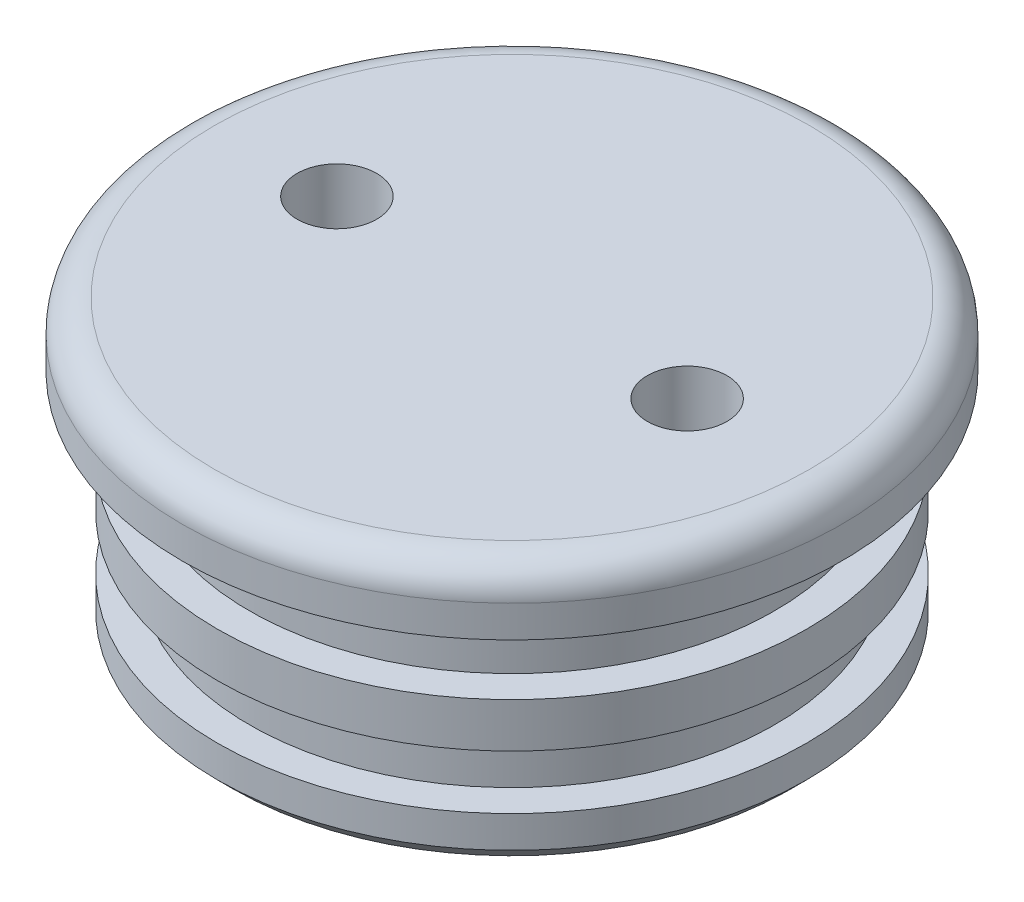
ISO-10303-21;
HEADER;
FILE_DESCRIPTION(('STEP AP214'),'2;1');
FILE_NAME('part.step','',(''),(''),'','','');
FILE_SCHEMA(('AUTOMOTIVE_DESIGN { 1 0 10303 214 1 1 1 1 }'));
ENDSEC;
DATA;
#1=APPLICATION_CONTEXT('core data for automotive mechanical design processes');
#2=APPLICATION_PROTOCOL_DEFINITION('international standard','automotive_design',2000,#1);
#3=PRODUCT_CONTEXT('',#1,'mechanical');
#4=PRODUCT('Part','Part','',(#3));
#5=PRODUCT_RELATED_PRODUCT_CATEGORY('part','',(#4));
#6=PRODUCT_DEFINITION_FORMATION('','',#4);
#7=PRODUCT_DEFINITION_CONTEXT('part definition',#1,'design');
#8=PRODUCT_DEFINITION('design','',#6,#7);
#9=PRODUCT_DEFINITION_SHAPE('','',#8);
#10=(LENGTH_UNIT() NAMED_UNIT(*) SI_UNIT(.MILLI.,.METRE.));
#11=(NAMED_UNIT(*) PLANE_ANGLE_UNIT() SI_UNIT($,.RADIAN.));
#12=(NAMED_UNIT(*) SI_UNIT($,.STERADIAN.) SOLID_ANGLE_UNIT());
#13=UNCERTAINTY_MEASURE_WITH_UNIT(LENGTH_MEASURE(1.E-05),#10,'distance_accuracy_value','');
#14=(GEOMETRIC_REPRESENTATION_CONTEXT(3) GLOBAL_UNCERTAINTY_ASSIGNED_CONTEXT((#13)) GLOBAL_UNIT_ASSIGNED_CONTEXT((#10,
#11,#12)) REPRESENTATION_CONTEXT('',''));
#15=CARTESIAN_POINT('',(0.,0.,0.));
#16=DIRECTION('',(0.,0.,1.));
#17=DIRECTION('',(1.,0.,0.));
#18=AXIS2_PLACEMENT_3D('',#15,#16,#17);
#19=CARTESIAN_POINT('',(0.,9.,0.));
#20=DIRECTION('',(0.,1.,0.));
#21=DIRECTION('',(0.,0.,1.));
#22=AXIS2_PLACEMENT_3D('',#19,#20,#21);
#23=PLANE('',#22);
#24=CARTESIAN_POINT('',(0.,9.,0.));
#25=DIRECTION('',(0.,1.,0.));
#26=DIRECTION('',(0.,0.,1.));
#27=AXIS2_PLACEMENT_3D('',#24,#25,#26);
#28=CIRCLE('',#27,9.35);
#29=CARTESIAN_POINT('',(0.,9.,9.35));
#30=VERTEX_POINT('',#29);
#31=EDGE_CURVE('E43',#30,#30,#28,.T.);
#32=ORIENTED_EDGE('',*,*,#31,.T.);
#33=EDGE_LOOP('',(#32));
#34=FACE_BOUND('',#33,.T.);
#35=CARTESIAN_POINT('',(5.5,9.,0.));
#36=DIRECTION('',(0.,1.,0.));
#37=DIRECTION('',(0.,0.,1.));
#38=AXIS2_PLACEMENT_3D('',#35,#36,#37);
#39=CIRCLE('',#38,1.25);
#40=CARTESIAN_POINT('',(5.5,9.,1.25));
#41=VERTEX_POINT('',#40);
#42=EDGE_CURVE('E173',#41,#41,#39,.T.);
#43=ORIENTED_EDGE('',*,*,#42,.F.);
#44=EDGE_LOOP('',(#43));
#45=FACE_BOUND('',#44,.T.);
#46=CARTESIAN_POINT('',(-5.5,9.,0.));
#47=DIRECTION('',(0.,1.,0.));
#48=DIRECTION('',(0.,0.,1.));
#49=AXIS2_PLACEMENT_3D('',#46,#47,#48);
#50=CIRCLE('',#49,1.25);
#51=CARTESIAN_POINT('',(-5.5,9.,1.25));
#52=VERTEX_POINT('',#51);
#53=EDGE_CURVE('E248',#52,#52,#50,.T.);
#54=ORIENTED_EDGE('',*,*,#53,.F.);
#55=EDGE_LOOP('',(#54));
#56=FACE_BOUND('',#55,.T.);
#57=ADVANCED_FACE('F35',(#34,#45,#56),#23,.T.);
#58=CARTESIAN_POINT('',(0.,7.,0.));
#59=DIRECTION('',(0.,-1.,0.));
#60=DIRECTION('',(0.,0.,-1.));
#61=AXIS2_PLACEMENT_3D('',#58,#59,#60);
#62=PLANE('',#61);
#63=CARTESIAN_POINT('',(0.,7.,0.));
#64=DIRECTION('',(0.,-1.,0.));
#65=DIRECTION('',(0.,0.,-1.));
#66=AXIS2_PLACEMENT_3D('',#63,#64,#65);
#67=CIRCLE('',#66,9.25);
#68=CARTESIAN_POINT('',(0.,7.,-9.25));
#69=VERTEX_POINT('',#68);
#70=EDGE_CURVE('E143',#69,#69,#67,.T.);
#71=ORIENTED_EDGE('',*,*,#70,.F.);
#72=EDGE_LOOP('',(#71));
#73=FACE_BOUND('',#72,.T.);
#74=CARTESIAN_POINT('',(0.,7.,0.));
#75=DIRECTION('',(0.,-1.,0.));
#76=DIRECTION('',(0.,0.,-1.));
#77=AXIS2_PLACEMENT_3D('',#74,#75,#76);
#78=CIRCLE('',#77,10.35);
#79=CARTESIAN_POINT('',(0.,7.,-10.35));
#80=VERTEX_POINT('',#79);
#81=EDGE_CURVE('E179',#80,#80,#78,.T.);
#82=ORIENTED_EDGE('',*,*,#81,.T.);
#83=EDGE_LOOP('',(#82));
#84=FACE_BOUND('',#83,.T.);
#85=ADVANCED_FACE('F197',(#73,#84),#62,.T.);
#86=CARTESIAN_POINT('',(2.5,7.,3.));
#87=DIRECTION('',(1.,0.,0.));
#88=DIRECTION('',(0.,0.,-1.));
#89=AXIS2_PLACEMENT_3D('',#86,#87,#88);
#90=PLANE('',#89);
#91=DIRECTION('',(0.,0.,-1.));
#92=VECTOR('',#91,1.);
#93=CARTESIAN_POINT('',(2.5,2.,0.));
#94=LINE('',#93,#92);
#95=CARTESIAN_POINT('',(2.5,2.,3.));
#96=VERTEX_POINT('',#95);
#97=CARTESIAN_POINT('',(2.5,2.,-3.));
#98=VERTEX_POINT('',#97);
#99=EDGE_CURVE('E101',#96,#98,#94,.T.);
#100=ORIENTED_EDGE('',*,*,#99,.F.);
#101=DIRECTION('',(0.,-1.,0.));
#102=VECTOR('',#101,1.);
#103=CARTESIAN_POINT('',(2.5,7.,3.));
#104=LINE('',#103,#102);
#105=CARTESIAN_POINT('',(2.5,7.,3.));
#106=VERTEX_POINT('',#105);
#107=EDGE_CURVE('E111',#106,#96,#104,.T.);
#108=ORIENTED_EDGE('',*,*,#107,.F.);
#109=DIRECTION('',(0.,0.,1.));
#110=VECTOR('',#109,1.);
#111=CARTESIAN_POINT('',(2.5,7.,3.));
#112=LINE('',#111,#110);
#113=CARTESIAN_POINT('',(2.5,7.,-3.));
#114=VERTEX_POINT('',#113);
#115=EDGE_CURVE('E165',#114,#106,#112,.T.);
#116=ORIENTED_EDGE('',*,*,#115,.F.);
#117=DIRECTION('',(0.,-1.,0.));
#118=VECTOR('',#117,1.);
#119=CARTESIAN_POINT('',(2.5,7.,-3.));
#120=LINE('',#119,#118);
#121=EDGE_CURVE('E113',#114,#98,#120,.T.);
#122=ORIENTED_EDGE('',*,*,#121,.T.);
#123=EDGE_LOOP('',(#100,#108,#116,#122));
#124=FACE_BOUND('',#123,.T.);
#125=ADVANCED_FACE('F109',(#124),#90,.F.);
#126=CARTESIAN_POINT('',(-2.5,7.,-3.));
#127=DIRECTION('',(0.,0.,-1.));
#128=DIRECTION('',(-1.,0.,0.));
#129=AXIS2_PLACEMENT_3D('',#126,#127,#128);
#130=PLANE('',#129);
#131=DIRECTION('',(-1.,0.,0.));
#132=VECTOR('',#131,1.);
#133=CARTESIAN_POINT('',(0.,2.,-3.));
#134=LINE('',#133,#132);
#135=CARTESIAN_POINT('',(-2.5,2.,-3.));
#136=VERTEX_POINT('',#135);
#137=EDGE_CURVE('E114',#98,#136,#134,.T.);
#138=ORIENTED_EDGE('',*,*,#137,.F.);
#139=ORIENTED_EDGE('',*,*,#121,.F.);
#140=DIRECTION('',(1.,0.,0.));
#141=VECTOR('',#140,1.);
#142=CARTESIAN_POINT('',(-2.5,7.,-3.));
#143=LINE('',#142,#141);
#144=CARTESIAN_POINT('',(-2.5,7.,-3.));
#145=VERTEX_POINT('',#144);
#146=EDGE_CURVE('E121',#145,#114,#143,.T.);
#147=ORIENTED_EDGE('',*,*,#146,.F.);
#148=DIRECTION('',(0.,-1.,0.));
#149=VECTOR('',#148,1.);
#150=CARTESIAN_POINT('',(-2.5,7.,-3.));
#151=LINE('',#150,#149);
#152=EDGE_CURVE('E123',#145,#136,#151,.T.);
#153=ORIENTED_EDGE('',*,*,#152,.T.);
#154=EDGE_LOOP('',(#138,#139,#147,#153));
#155=FACE_BOUND('',#154,.T.);
#156=ADVANCED_FACE('F263',(#155),#130,.F.);
#157=CARTESIAN_POINT('',(-2.5,7.,3.));
#158=DIRECTION('',(-1.,0.,0.));
#159=DIRECTION('',(0.,0.,1.));
#160=AXIS2_PLACEMENT_3D('',#157,#158,#159);
#161=PLANE('',#160);
#162=DIRECTION('',(0.,0.,1.));
#163=VECTOR('',#162,1.);
#164=CARTESIAN_POINT('',(-2.5,2.,0.));
#165=LINE('',#164,#163);
#166=CARTESIAN_POINT('',(-2.5,2.,3.));
#167=VERTEX_POINT('',#166);
#168=EDGE_CURVE('E58',#136,#167,#165,.T.);
#169=ORIENTED_EDGE('',*,*,#168,.F.);
#170=ORIENTED_EDGE('',*,*,#152,.F.);
#171=DIRECTION('',(0.,0.,-1.));
#172=VECTOR('',#171,1.);
#173=CARTESIAN_POINT('',(-2.5,7.,3.));
#174=LINE('',#173,#172);
#175=CARTESIAN_POINT('',(-2.5,7.,3.));
#176=VERTEX_POINT('',#175);
#177=EDGE_CURVE('E126',#176,#145,#174,.T.);
#178=ORIENTED_EDGE('',*,*,#177,.F.);
#179=DIRECTION('',(0.,-1.,0.));
#180=VECTOR('',#179,1.);
#181=CARTESIAN_POINT('',(-2.5,7.,3.));
#182=LINE('',#181,#180);
#183=EDGE_CURVE('E120',#176,#167,#182,.T.);
#184=ORIENTED_EDGE('',*,*,#183,.T.);
#185=EDGE_LOOP('',(#169,#170,#178,#184));
#186=FACE_BOUND('',#185,.T.);
#187=ADVANCED_FACE('F266',(#186),#161,.F.);
#188=CARTESIAN_POINT('',(-2.5,7.,3.));
#189=DIRECTION('',(0.,0.,1.));
#190=DIRECTION('',(1.,0.,0.));
#191=AXIS2_PLACEMENT_3D('',#188,#189,#190);
#192=PLANE('',#191);
#193=DIRECTION('',(1.,0.,0.));
#194=VECTOR('',#193,1.);
#195=CARTESIAN_POINT('',(0.,2.,3.));
#196=LINE('',#195,#194);
#197=EDGE_CURVE('E97',#167,#96,#196,.T.);
#198=ORIENTED_EDGE('',*,*,#197,.F.);
#199=ORIENTED_EDGE('',*,*,#183,.F.);
#200=DIRECTION('',(-1.,0.,0.));
#201=VECTOR('',#200,1.);
#202=CARTESIAN_POINT('',(-2.5,7.,3.));
#203=LINE('',#202,#201);
#204=EDGE_CURVE('E118',#106,#176,#203,.T.);
#205=ORIENTED_EDGE('',*,*,#204,.F.);
#206=ORIENTED_EDGE('',*,*,#107,.T.);
#207=EDGE_LOOP('',(#198,#199,#205,#206));
#208=FACE_BOUND('',#207,.T.);
#209=ADVANCED_FACE('F116',(#208),#192,.F.);
#210=CARTESIAN_POINT('',(5.5,0.,0.));
#211=DIRECTION('',(0.,1.,0.));
#212=DIRECTION('',(0.,0.,1.));
#213=AXIS2_PLACEMENT_3D('',#210,#211,#212);
#214=CYLINDRICAL_SURFACE('',#213,0.500000000000001);
#215=CARTESIAN_POINT('',(5.5,6.5,0.));
#216=DIRECTION('',(0.,1.,0.));
#217=DIRECTION('',(0.,0.,1.));
#218=AXIS2_PLACEMENT_3D('',#215,#216,#217);
#219=CIRCLE('',#218,0.500000000000001);
#220=CARTESIAN_POINT('',(5.5,6.5,0.500000000000001));
#221=VERTEX_POINT('',#220);
#222=EDGE_CURVE('E161',#221,#221,#219,.F.);
#223=ORIENTED_EDGE('',*,*,#222,.F.);
#224=EDGE_LOOP('',(#223));
#225=FACE_BOUND('',#224,.T.);
#226=CARTESIAN_POINT('',(5.5,1.5,0.));
#227=DIRECTION('',(0.,-1.,0.));
#228=DIRECTION('',(0.,0.,-1.));
#229=AXIS2_PLACEMENT_3D('',#226,#227,#228);
#230=CIRCLE('',#229,0.500000000000001);
#231=CARTESIAN_POINT('',(5.5,1.5,-0.500000000000001));
#232=VERTEX_POINT('',#231);
#233=EDGE_CURVE('E169',#232,#232,#230,.F.);
#234=ORIENTED_EDGE('',*,*,#233,.F.);
#235=EDGE_LOOP('',(#234));
#236=FACE_BOUND('',#235,.T.);
#237=ADVANCED_FACE('F206',(#225,#236),#214,.F.);
#238=CARTESIAN_POINT('',(-5.5,0.,0.));
#239=DIRECTION('',(0.,1.,0.));
#240=DIRECTION('',(0.,0.,1.));
#241=AXIS2_PLACEMENT_3D('',#238,#239,#240);
#242=CYLINDRICAL_SURFACE('',#241,0.500000000000001);
#243=CARTESIAN_POINT('',(-5.5,6.5,0.));
#244=DIRECTION('',(0.,1.,0.));
#245=DIRECTION('',(0.,0.,1.));
#246=AXIS2_PLACEMENT_3D('',#243,#244,#245);
#247=CIRCLE('',#246,0.500000000000001);
#248=CARTESIAN_POINT('',(-5.5,6.5,0.500000000000001));
#249=VERTEX_POINT('',#248);
#250=EDGE_CURVE('E158',#249,#249,#247,.F.);
#251=ORIENTED_EDGE('',*,*,#250,.F.);
#252=EDGE_LOOP('',(#251));
#253=FACE_BOUND('',#252,.T.);
#254=CARTESIAN_POINT('',(-5.5,1.5,0.));
#255=DIRECTION('',(0.,-1.,0.));
#256=DIRECTION('',(0.,0.,-1.));
#257=AXIS2_PLACEMENT_3D('',#254,#255,#256);
#258=CIRCLE('',#257,0.500000000000001);
#259=CARTESIAN_POINT('',(-5.5,1.5,-0.500000000000001));
#260=VERTEX_POINT('',#259);
#261=EDGE_CURVE('E166',#260,#260,#258,.F.);
#262=ORIENTED_EDGE('',*,*,#261,.F.);
#263=EDGE_LOOP('',(#262));
#264=FACE_BOUND('',#263,.T.);
#265=ADVANCED_FACE('F316',(#253,#264),#242,.F.);
#266=CARTESIAN_POINT('',(0.,7.,0.));
#267=DIRECTION('',(0.,-1.,0.));
#268=DIRECTION('',(0.,0.,-1.));
#269=AXIS2_PLACEMENT_3D('',#266,#267,#268);
#270=CYLINDRICAL_SURFACE('',#269,9.25);
#271=ORIENTED_EDGE('',*,*,#70,.T.);
#272=EDGE_LOOP('',(#271));
#273=FACE_BOUND('',#272,.T.);
#274=CARTESIAN_POINT('',(0.,6.3,0.));
#275=DIRECTION('',(0.,-1.,0.));
#276=DIRECTION('',(0.,0.,-1.));
#277=AXIS2_PLACEMENT_3D('',#274,#275,#276);
#278=CIRCLE('',#277,9.25);
#279=CARTESIAN_POINT('',(0.,6.3,-9.25));
#280=VERTEX_POINT('',#279);
#281=EDGE_CURVE('E147',#280,#280,#278,.F.);
#282=ORIENTED_EDGE('',*,*,#281,.T.);
#283=EDGE_LOOP('',(#282));
#284=FACE_BOUND('',#283,.T.);
#285=ADVANCED_FACE('F314',(#273,#284),#270,.T.);
#286=CARTESIAN_POINT('',(0.,0.500000000000007,0.));
#287=DIRECTION('',(0.,1.,0.));
#288=DIRECTION('',(0.,0.,1.));
#289=AXIS2_PLACEMENT_3D('',#286,#287,#288);
#290=CIRCLE('',#289,9.25);
#291=CARTESIAN_POINT('',(0.,0.500000000000007,9.25));
#292=VERTEX_POINT('',#291);
#293=EDGE_CURVE('E176',#292,#292,#290,.T.);
#294=ORIENTED_EDGE('',*,*,#293,.T.);
#295=EDGE_LOOP('',(#294));
#296=FACE_BOUND('',#295,.T.);
#297=CARTESIAN_POINT('',(0.,1.5,0.));
#298=DIRECTION('',(0.,1.,0.));
#299=DIRECTION('',(0.,0.,1.));
#300=AXIS2_PLACEMENT_3D('',#297,#298,#299);
#301=CIRCLE('',#300,9.25);
#302=CARTESIAN_POINT('',(0.,1.5,9.25));
#303=VERTEX_POINT('',#302);
#304=EDGE_CURVE('E137',#303,#303,#301,.F.);
#305=ORIENTED_EDGE('',*,*,#304,.T.);
#306=EDGE_LOOP('',(#305));
#307=FACE_BOUND('',#306,.T.);
#308=ADVANCED_FACE('F211',(#296,#307),#270,.T.);
#309=CARTESIAN_POINT('',(0.,0.,0.));
#310=DIRECTION('',(0.,1.,0.));
#311=DIRECTION('',(0.,0.,1.));
#312=AXIS2_PLACEMENT_3D('',#309,#310,#311);
#313=PLANE('',#312);
#314=CARTESIAN_POINT('',(0.,0.,0.));
#315=DIRECTION('',(0.,1.,0.));
#316=DIRECTION('',(0.,0.,1.));
#317=AXIS2_PLACEMENT_3D('',#314,#315,#316);
#318=CIRCLE('',#317,8.75);
#319=CARTESIAN_POINT('',(0.,0.,8.75));
#320=VERTEX_POINT('',#319);
#321=EDGE_CURVE('E146',#320,#320,#318,.F.);
#322=ORIENTED_EDGE('',*,*,#321,.T.);
#323=EDGE_LOOP('',(#322));
#324=FACE_BOUND('',#323,.T.);
#325=DIRECTION('',(0.,0.,1.));
#326=VECTOR('',#325,1.);
#327=CARTESIAN_POINT('',(3.5,0.,0.));
#328=LINE('',#327,#326);
#329=CARTESIAN_POINT('',(3.5,0.,-4.));
#330=VERTEX_POINT('',#329);
#331=CARTESIAN_POINT('',(3.5,0.,4.));
#332=VERTEX_POINT('',#331);
#333=EDGE_CURVE('E228',#330,#332,#328,.T.);
#334=ORIENTED_EDGE('',*,*,#333,.F.);
#335=DIRECTION('',(1.,0.,0.));
#336=VECTOR('',#335,1.);
#337=CARTESIAN_POINT('',(0.,0.,-4.));
#338=LINE('',#337,#336);
#339=CARTESIAN_POINT('',(-3.5,0.,-4.));
#340=VERTEX_POINT('',#339);
#341=EDGE_CURVE('E50',#340,#330,#338,.T.);
#342=ORIENTED_EDGE('',*,*,#341,.F.);
#343=DIRECTION('',(0.,0.,-1.));
#344=VECTOR('',#343,1.);
#345=CARTESIAN_POINT('',(-3.5,0.,0.));
#346=LINE('',#345,#344);
#347=CARTESIAN_POINT('',(-3.5,0.,4.));
#348=VERTEX_POINT('',#347);
#349=EDGE_CURVE('E610',#348,#340,#346,.T.);
#350=ORIENTED_EDGE('',*,*,#349,.F.);
#351=DIRECTION('',(-1.,0.,0.));
#352=VECTOR('',#351,1.);
#353=CARTESIAN_POINT('',(0.,0.,4.));
#354=LINE('',#353,#352);
#355=EDGE_CURVE('E605',#332,#348,#354,.T.);
#356=ORIENTED_EDGE('',*,*,#355,.F.);
#357=EDGE_LOOP('',(#334,#342,#350,#356));
#358=FACE_BOUND('',#357,.T.);
#359=CARTESIAN_POINT('',(-5.5,0.,0.));
#360=DIRECTION('',(0.,-1.,0.));
#361=DIRECTION('',(0.,0.,-1.));
#362=AXIS2_PLACEMENT_3D('',#359,#360,#361);
#363=CIRCLE('',#362,1.25);
#364=CARTESIAN_POINT('',(-5.5,0.,-1.25));
#365=VERTEX_POINT('',#364);
#366=EDGE_CURVE('E232',#365,#365,#363,.T.);
#367=ORIENTED_EDGE('',*,*,#366,.F.);
#368=EDGE_LOOP('',(#367));
#369=FACE_BOUND('',#368,.T.);
#370=CARTESIAN_POINT('',(5.5,0.,0.));
#371=DIRECTION('',(0.,-1.,0.));
#372=DIRECTION('',(0.,0.,-1.));
#373=AXIS2_PLACEMENT_3D('',#370,#371,#372);
#374=CIRCLE('',#373,1.25);
#375=CARTESIAN_POINT('',(5.5,0.,-1.25));
#376=VERTEX_POINT('',#375);
#377=EDGE_CURVE('E235',#376,#376,#374,.T.);
#378=ORIENTED_EDGE('',*,*,#377,.F.);
#379=EDGE_LOOP('',(#378));
#380=FACE_BOUND('',#379,.T.);
#381=ADVANCED_FACE('F208',(#324,#358,#369,#380),#313,.F.);
#382=CARTESIAN_POINT('',(0.,0.,0.));
#383=DIRECTION('',(0.,-1.,0.));
#384=DIRECTION('',(0.,0.,-1.));
#385=AXIS2_PLACEMENT_3D('',#382,#383,#384);
#386=CYLINDRICAL_SURFACE('',#385,8.25);
#387=CARTESIAN_POINT('',(0.,3.2,0.));
#388=DIRECTION('',(0.,-1.,0.));
#389=DIRECTION('',(0.,0.,-1.));
#390=AXIS2_PLACEMENT_3D('',#387,#388,#389);
#391=CIRCLE('',#390,8.25);
#392=CARTESIAN_POINT('',(0.,3.2,-8.25));
#393=VERTEX_POINT('',#392);
#394=EDGE_CURVE('E134',#393,#393,#391,.T.);
#395=ORIENTED_EDGE('',*,*,#394,.T.);
#396=EDGE_LOOP('',(#395));
#397=FACE_BOUND('',#396,.T.);
#398=CARTESIAN_POINT('',(0.,1.5,0.));
#399=DIRECTION('',(0.,-1.,0.));
#400=DIRECTION('',(0.,0.,-1.));
#401=AXIS2_PLACEMENT_3D('',#398,#399,#400);
#402=CIRCLE('',#401,8.25);
#403=CARTESIAN_POINT('',(0.,1.5,-8.25));
#404=VERTEX_POINT('',#403);
#405=EDGE_CURVE('E138',#404,#404,#402,.T.);
#406=ORIENTED_EDGE('',*,*,#405,.F.);
#407=EDGE_LOOP('',(#406));
#408=FACE_BOUND('',#407,.T.);
#409=ADVANCED_FACE('F210',(#397,#408),#386,.T.);
#410=CARTESIAN_POINT('',(-10.25,3.2,0.));
#411=DIRECTION('',(0.,-1.,0.));
#412=DIRECTION('',(0.,0.,-1.));
#413=AXIS2_PLACEMENT_3D('',#410,#411,#412);
#414=PLANE('',#413);
#415=CARTESIAN_POINT('',(0.,3.2,0.));
#416=DIRECTION('',(0.,-1.,0.));
#417=DIRECTION('',(0.,0.,-1.));
#418=AXIS2_PLACEMENT_3D('',#415,#416,#417);
#419=CIRCLE('',#418,9.25);
#420=CARTESIAN_POINT('',(0.,3.2,-9.25));
#421=VERTEX_POINT('',#420);
#422=EDGE_CURVE('E150',#421,#421,#419,.F.);
#423=ORIENTED_EDGE('',*,*,#422,.F.);
#424=EDGE_LOOP('',(#423));
#425=FACE_BOUND('',#424,.T.);
#426=ORIENTED_EDGE('',*,*,#394,.F.);
#427=EDGE_LOOP('',(#426));
#428=FACE_BOUND('',#427,.T.);
#429=ADVANCED_FACE('F306',(#425,#428),#414,.T.);
#430=CARTESIAN_POINT('',(-10.25,1.5,0.));
#431=DIRECTION('',(0.,1.,0.));
#432=DIRECTION('',(0.,0.,1.));
#433=AXIS2_PLACEMENT_3D('',#430,#431,#432);
#434=PLANE('',#433);
#435=ORIENTED_EDGE('',*,*,#304,.F.);
#436=EDGE_LOOP('',(#435));
#437=FACE_BOUND('',#436,.T.);
#438=ORIENTED_EDGE('',*,*,#405,.T.);
#439=EDGE_LOOP('',(#438));
#440=FACE_BOUND('',#439,.T.);
#441=ADVANCED_FACE('F303',(#437,#440),#434,.T.);
#442=ORIENTED_EDGE('',*,*,#422,.T.);
#443=EDGE_LOOP('',(#442));
#444=FACE_BOUND('',#443,.T.);
#445=CARTESIAN_POINT('',(0.,4.6,0.));
#446=DIRECTION('',(0.,1.,0.));
#447=DIRECTION('',(0.,0.,1.));
#448=AXIS2_PLACEMENT_3D('',#445,#446,#447);
#449=CIRCLE('',#448,9.25);
#450=CARTESIAN_POINT('',(0.,4.6,9.25));
#451=VERTEX_POINT('',#450);
#452=EDGE_CURVE('E153',#451,#451,#449,.F.);
#453=ORIENTED_EDGE('',*,*,#452,.T.);
#454=EDGE_LOOP('',(#453));
#455=FACE_BOUND('',#454,.T.);
#456=ADVANCED_FACE('F301',(#444,#455),#270,.T.);
#457=CARTESIAN_POINT('',(0.,0.,0.));
#458=DIRECTION('',(0.,-1.,0.));
#459=DIRECTION('',(0.,0.,-1.));
#460=AXIS2_PLACEMENT_3D('',#457,#458,#459);
#461=CYLINDRICAL_SURFACE('',#460,8.25);
#462=CARTESIAN_POINT('',(0.,6.3,0.));
#463=DIRECTION('',(0.,-1.,0.));
#464=DIRECTION('',(0.,0.,-1.));
#465=AXIS2_PLACEMENT_3D('',#462,#463,#464);
#466=CIRCLE('',#465,8.25);
#467=CARTESIAN_POINT('',(0.,6.3,-8.25));
#468=VERTEX_POINT('',#467);
#469=EDGE_CURVE('E133',#468,#468,#466,.T.);
#470=ORIENTED_EDGE('',*,*,#469,.T.);
#471=EDGE_LOOP('',(#470));
#472=FACE_BOUND('',#471,.T.);
#473=CARTESIAN_POINT('',(0.,4.6,0.));
#474=DIRECTION('',(0.,-1.,0.));
#475=DIRECTION('',(0.,0.,-1.));
#476=AXIS2_PLACEMENT_3D('',#473,#474,#475);
#477=CIRCLE('',#476,8.25);
#478=CARTESIAN_POINT('',(0.,4.6,-8.25));
#479=VERTEX_POINT('',#478);
#480=EDGE_CURVE('E130',#479,#479,#477,.T.);
#481=ORIENTED_EDGE('',*,*,#480,.F.);
#482=EDGE_LOOP('',(#481));
#483=FACE_BOUND('',#482,.T.);
#484=ADVANCED_FACE('F297',(#472,#483),#461,.T.);
#485=CARTESIAN_POINT('',(-10.25,6.3,0.));
#486=DIRECTION('',(0.,-1.,0.));
#487=DIRECTION('',(0.,0.,-1.));
#488=AXIS2_PLACEMENT_3D('',#485,#486,#487);
#489=PLANE('',#488);
#490=ORIENTED_EDGE('',*,*,#281,.F.);
#491=EDGE_LOOP('',(#490));
#492=FACE_BOUND('',#491,.T.);
#493=ORIENTED_EDGE('',*,*,#469,.F.);
#494=EDGE_LOOP('',(#493));
#495=FACE_BOUND('',#494,.T.);
#496=ADVANCED_FACE('F280',(#492,#495),#489,.T.);
#497=CARTESIAN_POINT('',(-10.25,4.6,0.));
#498=DIRECTION('',(0.,1.,0.));
#499=DIRECTION('',(0.,0.,1.));
#500=AXIS2_PLACEMENT_3D('',#497,#498,#499);
#501=PLANE('',#500);
#502=ORIENTED_EDGE('',*,*,#452,.F.);
#503=EDGE_LOOP('',(#502));
#504=FACE_BOUND('',#503,.T.);
#505=ORIENTED_EDGE('',*,*,#480,.T.);
#506=EDGE_LOOP('',(#505));
#507=FACE_BOUND('',#506,.T.);
#508=ADVANCED_FACE('F271',(#504,#507),#501,.T.);
#509=CARTESIAN_POINT('',(0.,7.,0.));
#510=DIRECTION('',(0.,-1.,0.));
#511=DIRECTION('',(0.,0.,-1.));
#512=AXIS2_PLACEMENT_3D('',#509,#510,#511);
#513=PLANE('',#512);
#514=ORIENTED_EDGE('',*,*,#115,.T.);
#515=ORIENTED_EDGE('',*,*,#204,.T.);
#516=ORIENTED_EDGE('',*,*,#177,.T.);
#517=ORIENTED_EDGE('',*,*,#146,.T.);
#518=EDGE_LOOP('',(#514,#515,#516,#517));
#519=FACE_BOUND('',#518,.T.);
#520=ADVANCED_FACE('F268',(#519),#513,.T.);
#521=CARTESIAN_POINT('',(-5.5,6.5,0.));
#522=DIRECTION('',(0.,1.,0.));
#523=DIRECTION('',(0.,0.,1.));
#524=AXIS2_PLACEMENT_3D('',#521,#522,#523);
#525=PLANE('',#524);
#526=CARTESIAN_POINT('',(-5.5,6.5,0.));
#527=DIRECTION('',(0.,1.,0.));
#528=DIRECTION('',(0.,0.,1.));
#529=AXIS2_PLACEMENT_3D('',#526,#527,#528);
#530=CIRCLE('',#529,1.25);
#531=CARTESIAN_POINT('',(-5.5,6.5,1.25));
#532=VERTEX_POINT('',#531);
#533=EDGE_CURVE('E162',#532,#532,#530,.T.);
#534=ORIENTED_EDGE('',*,*,#533,.T.);
#535=EDGE_LOOP('',(#534));
#536=FACE_BOUND('',#535,.T.);
#537=ORIENTED_EDGE('',*,*,#250,.T.);
#538=EDGE_LOOP('',(#537));
#539=FACE_BOUND('',#538,.T.);
#540=ADVANCED_FACE('F270',(#536,#539),#525,.T.);
#541=CARTESIAN_POINT('',(-5.5,6.5,0.));
#542=DIRECTION('',(0.,1.,0.));
#543=DIRECTION('',(0.,0.,1.));
#544=AXIS2_PLACEMENT_3D('',#541,#542,#543);
#545=CYLINDRICAL_SURFACE('',#544,1.25);
#546=ORIENTED_EDGE('',*,*,#533,.F.);
#547=EDGE_LOOP('',(#546));
#548=FACE_BOUND('',#547,.T.);
#549=ORIENTED_EDGE('',*,*,#53,.T.);
#550=EDGE_LOOP('',(#549));
#551=FACE_BOUND('',#550,.T.);
#552=ADVANCED_FACE('F277',(#548,#551),#545,.F.);
#553=CARTESIAN_POINT('',(5.5,6.5,0.));
#554=DIRECTION('',(0.,1.,0.));
#555=DIRECTION('',(0.,0.,1.));
#556=AXIS2_PLACEMENT_3D('',#553,#554,#555);
#557=PLANE('',#556);
#558=CARTESIAN_POINT('',(5.5,6.5,0.));
#559=DIRECTION('',(0.,1.,0.));
#560=DIRECTION('',(0.,0.,1.));
#561=AXIS2_PLACEMENT_3D('',#558,#559,#560);
#562=CIRCLE('',#561,1.25);
#563=CARTESIAN_POINT('',(5.5,6.5,1.25));
#564=VERTEX_POINT('',#563);
#565=EDGE_CURVE('E251',#564,#564,#562,.T.);
#566=ORIENTED_EDGE('',*,*,#565,.T.);
#567=EDGE_LOOP('',(#566));
#568=FACE_BOUND('',#567,.T.);
#569=ORIENTED_EDGE('',*,*,#222,.T.);
#570=EDGE_LOOP('',(#569));
#571=FACE_BOUND('',#570,.T.);
#572=ADVANCED_FACE('F352',(#568,#571),#557,.T.);
#573=CARTESIAN_POINT('',(5.5,6.5,0.));
#574=DIRECTION('',(0.,1.,0.));
#575=DIRECTION('',(0.,0.,1.));
#576=AXIS2_PLACEMENT_3D('',#573,#574,#575);
#577=CYLINDRICAL_SURFACE('',#576,1.25);
#578=ORIENTED_EDGE('',*,*,#565,.F.);
#579=EDGE_LOOP('',(#578));
#580=FACE_BOUND('',#579,.T.);
#581=ORIENTED_EDGE('',*,*,#42,.T.);
#582=EDGE_LOOP('',(#581));
#583=FACE_BOUND('',#582,.T.);
#584=ADVANCED_FACE('F285',(#580,#583),#577,.F.);
#585=CARTESIAN_POINT('',(5.5,1.5,0.));
#586=DIRECTION('',(0.,-1.,0.));
#587=DIRECTION('',(0.,0.,-1.));
#588=AXIS2_PLACEMENT_3D('',#585,#586,#587);
#589=PLANE('',#588);
#590=CARTESIAN_POINT('',(5.5,1.5,0.));
#591=DIRECTION('',(0.,-1.,0.));
#592=DIRECTION('',(0.,0.,-1.));
#593=AXIS2_PLACEMENT_3D('',#590,#591,#592);
#594=CIRCLE('',#593,1.25);
#595=CARTESIAN_POINT('',(5.5,1.5,-1.25));
#596=VERTEX_POINT('',#595);
#597=EDGE_CURVE('E237',#596,#596,#594,.T.);
#598=ORIENTED_EDGE('',*,*,#597,.T.);
#599=EDGE_LOOP('',(#598));
#600=FACE_BOUND('',#599,.T.);
#601=ORIENTED_EDGE('',*,*,#233,.T.);
#602=EDGE_LOOP('',(#601));
#603=FACE_BOUND('',#602,.T.);
#604=ADVANCED_FACE('F341',(#600,#603),#589,.T.);
#605=CARTESIAN_POINT('',(5.5,1.5,0.));
#606=DIRECTION('',(0.,-1.,0.));
#607=DIRECTION('',(0.,0.,-1.));
#608=AXIS2_PLACEMENT_3D('',#605,#606,#607);
#609=CYLINDRICAL_SURFACE('',#608,1.25);
#610=ORIENTED_EDGE('',*,*,#597,.F.);
#611=EDGE_LOOP('',(#610));
#612=FACE_BOUND('',#611,.T.);
#613=ORIENTED_EDGE('',*,*,#377,.T.);
#614=EDGE_LOOP('',(#613));
#615=FACE_BOUND('',#614,.T.);
#616=ADVANCED_FACE('F331',(#612,#615),#609,.F.);
#617=CARTESIAN_POINT('',(-5.5,1.5,0.));
#618=DIRECTION('',(0.,-1.,0.));
#619=DIRECTION('',(0.,0.,-1.));
#620=AXIS2_PLACEMENT_3D('',#617,#618,#619);
#621=PLANE('',#620);
#622=CARTESIAN_POINT('',(-5.5,1.5,0.));
#623=DIRECTION('',(0.,-1.,0.));
#624=DIRECTION('',(0.,0.,-1.));
#625=AXIS2_PLACEMENT_3D('',#622,#623,#624);
#626=CIRCLE('',#625,1.25);
#627=CARTESIAN_POINT('',(-5.5,1.5,-1.25));
#628=VERTEX_POINT('',#627);
#629=EDGE_CURVE('E170',#628,#628,#626,.T.);
#630=ORIENTED_EDGE('',*,*,#629,.T.);
#631=EDGE_LOOP('',(#630));
#632=FACE_BOUND('',#631,.T.);
#633=ORIENTED_EDGE('',*,*,#261,.T.);
#634=EDGE_LOOP('',(#633));
#635=FACE_BOUND('',#634,.T.);
#636=ADVANCED_FACE('F328',(#632,#635),#621,.T.);
#637=CARTESIAN_POINT('',(-5.5,1.5,0.));
#638=DIRECTION('',(0.,-1.,0.));
#639=DIRECTION('',(0.,0.,-1.));
#640=AXIS2_PLACEMENT_3D('',#637,#638,#639);
#641=CYLINDRICAL_SURFACE('',#640,1.25);
#642=ORIENTED_EDGE('',*,*,#629,.F.);
#643=EDGE_LOOP('',(#642));
#644=FACE_BOUND('',#643,.T.);
#645=ORIENTED_EDGE('',*,*,#366,.T.);
#646=EDGE_LOOP('',(#645));
#647=FACE_BOUND('',#646,.T.);
#648=ADVANCED_FACE('F330',(#644,#647),#641,.F.);
#649=CARTESIAN_POINT('',(0.,2.,-4.));
#650=DIRECTION('',(0.,0.,-1.));
#651=DIRECTION('',(-1.,0.,0.));
#652=AXIS2_PLACEMENT_3D('',#649,#650,#651);
#653=PLANE('',#652);
#654=ORIENTED_EDGE('',*,*,#341,.T.);
#655=DIRECTION('',(0.,-1.,0.));
#656=VECTOR('',#655,1.);
#657=CARTESIAN_POINT('',(3.5,2.,-4.));
#658=LINE('',#657,#656);
#659=CARTESIAN_POINT('',(3.5,2.,-4.));
#660=VERTEX_POINT('',#659);
#661=EDGE_CURVE('E604',#660,#330,#658,.T.);
#662=ORIENTED_EDGE('',*,*,#661,.F.);
#663=DIRECTION('',(1.,0.,0.));
#664=VECTOR('',#663,1.);
#665=CARTESIAN_POINT('',(0.,2.,-4.));
#666=LINE('',#665,#664);
#667=CARTESIAN_POINT('',(-3.5,2.,-4.));
#668=VERTEX_POINT('',#667);
#669=EDGE_CURVE('E632',#668,#660,#666,.T.);
#670=ORIENTED_EDGE('',*,*,#669,.F.);
#671=DIRECTION('',(0.,-1.,0.));
#672=VECTOR('',#671,1.);
#673=CARTESIAN_POINT('',(-3.5,2.,-4.));
#674=LINE('',#673,#672);
#675=EDGE_CURVE('E238',#668,#340,#674,.T.);
#676=ORIENTED_EDGE('',*,*,#675,.T.);
#677=EDGE_LOOP('',(#654,#662,#670,#676));
#678=FACE_BOUND('',#677,.T.);
#679=ADVANCED_FACE('F338',(#678),#653,.F.);
#680=CARTESIAN_POINT('',(-3.5,2.,0.));
#681=DIRECTION('',(-1.,0.,0.));
#682=DIRECTION('',(0.,0.,1.));
#683=AXIS2_PLACEMENT_3D('',#680,#681,#682);
#684=PLANE('',#683);
#685=ORIENTED_EDGE('',*,*,#349,.T.);
#686=ORIENTED_EDGE('',*,*,#675,.F.);
#687=DIRECTION('',(0.,0.,-1.));
#688=VECTOR('',#687,1.);
#689=CARTESIAN_POINT('',(-3.5,2.,0.));
#690=LINE('',#689,#688);
#691=CARTESIAN_POINT('',(-3.5,2.,4.));
#692=VERTEX_POINT('',#691);
#693=EDGE_CURVE('E618',#692,#668,#690,.T.);
#694=ORIENTED_EDGE('',*,*,#693,.F.);
#695=DIRECTION('',(0.,-1.,0.));
#696=VECTOR('',#695,1.);
#697=CARTESIAN_POINT('',(-3.5,2.,4.));
#698=LINE('',#697,#696);
#699=EDGE_CURVE('E242',#692,#348,#698,.T.);
#700=ORIENTED_EDGE('',*,*,#699,.T.);
#701=EDGE_LOOP('',(#685,#686,#694,#700));
#702=FACE_BOUND('',#701,.T.);
#703=ADVANCED_FACE('F425',(#702),#684,.F.);
#704=CARTESIAN_POINT('',(0.,2.,4.));
#705=DIRECTION('',(0.,0.,1.));
#706=DIRECTION('',(1.,0.,0.));
#707=AXIS2_PLACEMENT_3D('',#704,#705,#706);
#708=PLANE('',#707);
#709=ORIENTED_EDGE('',*,*,#355,.T.);
#710=ORIENTED_EDGE('',*,*,#699,.F.);
#711=DIRECTION('',(-1.,0.,0.));
#712=VECTOR('',#711,1.);
#713=CARTESIAN_POINT('',(0.,2.,4.));
#714=LINE('',#713,#712);
#715=CARTESIAN_POINT('',(3.5,2.,4.));
#716=VERTEX_POINT('',#715);
#717=EDGE_CURVE('E622',#716,#692,#714,.T.);
#718=ORIENTED_EDGE('',*,*,#717,.F.);
#719=DIRECTION('',(0.,-1.,0.));
#720=VECTOR('',#719,1.);
#721=CARTESIAN_POINT('',(3.5,2.,4.));
#722=LINE('',#721,#720);
#723=EDGE_CURVE('E602',#716,#332,#722,.T.);
#724=ORIENTED_EDGE('',*,*,#723,.T.);
#725=EDGE_LOOP('',(#709,#710,#718,#724));
#726=FACE_BOUND('',#725,.T.);
#727=ADVANCED_FACE('F433',(#726),#708,.F.);
#728=CARTESIAN_POINT('',(3.5,2.,0.));
#729=DIRECTION('',(1.,0.,0.));
#730=DIRECTION('',(0.,0.,-1.));
#731=AXIS2_PLACEMENT_3D('',#728,#729,#730);
#732=PLANE('',#731);
#733=ORIENTED_EDGE('',*,*,#333,.T.);
#734=ORIENTED_EDGE('',*,*,#723,.F.);
#735=DIRECTION('',(0.,0.,1.));
#736=VECTOR('',#735,1.);
#737=CARTESIAN_POINT('',(3.5,2.,0.));
#738=LINE('',#737,#736);
#739=EDGE_CURVE('E627',#660,#716,#738,.T.);
#740=ORIENTED_EDGE('',*,*,#739,.F.);
#741=ORIENTED_EDGE('',*,*,#661,.T.);
#742=EDGE_LOOP('',(#733,#734,#740,#741));
#743=FACE_BOUND('',#742,.T.);
#744=ADVANCED_FACE('F218',(#743),#732,.F.);
#745=CARTESIAN_POINT('',(0.,2.,0.));
#746=DIRECTION('',(0.,-1.,0.));
#747=DIRECTION('',(0.,0.,-1.));
#748=AXIS2_PLACEMENT_3D('',#745,#746,#747);
#749=PLANE('',#748);
#750=ORIENTED_EDGE('',*,*,#168,.T.);
#751=ORIENTED_EDGE('',*,*,#197,.T.);
#752=ORIENTED_EDGE('',*,*,#99,.T.);
#753=ORIENTED_EDGE('',*,*,#137,.T.);
#754=EDGE_LOOP('',(#750,#751,#752,#753));
#755=FACE_BOUND('',#754,.T.);
#756=ORIENTED_EDGE('',*,*,#669,.T.);
#757=ORIENTED_EDGE('',*,*,#739,.T.);
#758=ORIENTED_EDGE('',*,*,#717,.T.);
#759=ORIENTED_EDGE('',*,*,#693,.T.);
#760=EDGE_LOOP('',(#756,#757,#758,#759));
#761=FACE_BOUND('',#760,.T.);
#762=ADVANCED_FACE('F99',(#755,#761),#749,.T.);
#763=CARTESIAN_POINT('',(0.,0.,0.));
#764=DIRECTION('',(0.,1.,0.));
#765=DIRECTION('',(0.,0.,1.));
#766=AXIS2_PLACEMENT_3D('',#763,#764,#765);
#767=CONICAL_SURFACE('',#766,8.75,0.785398163397443);
#768=ORIENTED_EDGE('',*,*,#293,.F.);
#769=EDGE_LOOP('',(#768));
#770=FACE_BOUND('',#769,.T.);
#771=ORIENTED_EDGE('',*,*,#321,.F.);
#772=EDGE_LOOP('',(#771));
#773=FACE_BOUND('',#772,.T.);
#774=ADVANCED_FACE('F192',(#770,#773),#767,.T.);
#775=CARTESIAN_POINT('',(0.,-1.,0.));
#776=DIRECTION('',(0.,1.,0.));
#777=DIRECTION('',(0.,0.,1.));
#778=AXIS2_PLACEMENT_3D('',#775,#776,#777);
#779=CYLINDRICAL_SURFACE('',#778,10.35);
#780=CARTESIAN_POINT('',(0.,8.,0.));
#781=DIRECTION('',(0.,1.,0.));
#782=DIRECTION('',(0.,0.,1.));
#783=AXIS2_PLACEMENT_3D('',#780,#781,#782);
#784=CIRCLE('',#783,10.35);
#785=CARTESIAN_POINT('',(0.,8.,10.35));
#786=VERTEX_POINT('',#785);
#787=EDGE_CURVE('E11',#786,#786,#784,.F.);
#788=ORIENTED_EDGE('',*,*,#787,.T.);
#789=EDGE_LOOP('',(#788));
#790=FACE_BOUND('',#789,.T.);
#791=ORIENTED_EDGE('',*,*,#81,.F.);
#792=EDGE_LOOP('',(#791));
#793=FACE_BOUND('',#792,.T.);
#794=ADVANCED_FACE('F187',(#790,#793),#779,.T.);
#795=CARTESIAN_POINT('',(0.,8.,0.));
#796=DIRECTION('',(0.,1.,0.));
#797=DIRECTION('',(0.,0.,1.));
#798=AXIS2_PLACEMENT_3D('',#795,#796,#797);
#799=TOROIDAL_SURFACE('',#798,9.35,1.);
#800=ORIENTED_EDGE('',*,*,#787,.F.);
#801=EDGE_LOOP('',(#800));
#802=FACE_BOUND('',#801,.T.);
#803=ORIENTED_EDGE('',*,*,#31,.F.);
#804=EDGE_LOOP('',(#803));
#805=FACE_BOUND('',#804,.T.);
#806=ADVANCED_FACE('F37',(#802,#805),#799,.T.);
#807=CLOSED_SHELL('',(#57,#85,#125,#156,#187,#209,#237,#265,#285,#308,#381,#409,#429,#441,#456,
#484,#496,#508,#520,#540,#552,#572,#584,#604,#616,#636,#648,#679,#703,#727,#744,#762,#774,#794,#806));
#808=MANIFOLD_SOLID_BREP('B2',#807);
#809=ADVANCED_BREP_SHAPE_REPRESENTATION('',(#18,#808),#14);
#810=SHAPE_DEFINITION_REPRESENTATION(#9,#809);
ENDSEC;
END-ISO-10303-21;
